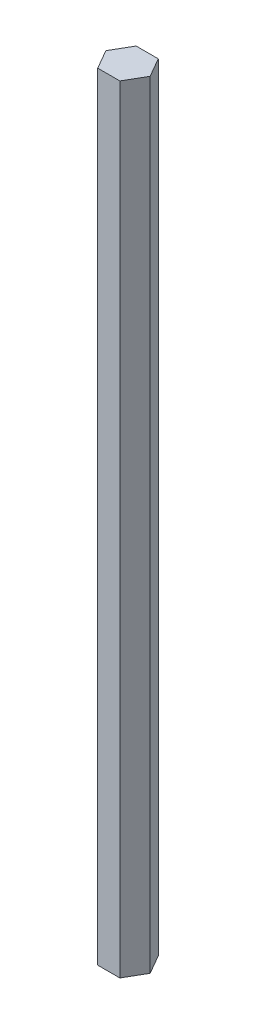
ISO-10303-21;
HEADER;
FILE_DESCRIPTION(('STEP AP214'),'2;1');
FILE_NAME('part.step','',(''),(''),'','','');
FILE_SCHEMA(('AUTOMOTIVE_DESIGN { 1 0 10303 214 1 1 1 1 }'));
ENDSEC;
DATA;
#1=APPLICATION_CONTEXT('core data for automotive mechanical design processes');
#2=APPLICATION_PROTOCOL_DEFINITION('international standard','automotive_design',2000,#1);
#3=PRODUCT_CONTEXT('',#1,'mechanical');
#4=PRODUCT('Part','Part','',(#3));
#5=PRODUCT_RELATED_PRODUCT_CATEGORY('part','',(#4));
#6=PRODUCT_DEFINITION_FORMATION('','',#4);
#7=PRODUCT_DEFINITION_CONTEXT('part definition',#1,'design');
#8=PRODUCT_DEFINITION('design','',#6,#7);
#9=PRODUCT_DEFINITION_SHAPE('','',#8);
#10=(LENGTH_UNIT() NAMED_UNIT(*) SI_UNIT(.MILLI.,.METRE.));
#11=(NAMED_UNIT(*) PLANE_ANGLE_UNIT() SI_UNIT($,.RADIAN.));
#12=(NAMED_UNIT(*) SI_UNIT($,.STERADIAN.) SOLID_ANGLE_UNIT());
#13=UNCERTAINTY_MEASURE_WITH_UNIT(LENGTH_MEASURE(1.E-05),#10,'distance_accuracy_value','');
#14=(GEOMETRIC_REPRESENTATION_CONTEXT(3) GLOBAL_UNCERTAINTY_ASSIGNED_CONTEXT((#13)) GLOBAL_UNIT_ASSIGNED_CONTEXT((#10,
#11,#12)) REPRESENTATION_CONTEXT('',''));
#15=CARTESIAN_POINT('',(0.,0.,0.));
#16=DIRECTION('',(0.,0.,1.));
#17=DIRECTION('',(1.,0.,0.));
#18=AXIS2_PLACEMENT_3D('',#15,#16,#17);
#19=CARTESIAN_POINT('',(1.5,105.2,2.59807621135332));
#20=DIRECTION('',(-0.866025403784439,0.,-0.5));
#21=DIRECTION('',(-0.5,0.,0.866025403784439));
#22=AXIS2_PLACEMENT_3D('',#19,#20,#21);
#23=PLANE('',#22);
#24=DIRECTION('',(0.5,0.,-0.866025403784439));
#25=VECTOR('',#24,1.);
#26=CARTESIAN_POINT('',(1.5,0.,2.59807621135332));
#27=LINE('',#26,#25);
#28=CARTESIAN_POINT('',(1.5,0.,2.59807621135332));
#29=VERTEX_POINT('',#28);
#30=CARTESIAN_POINT('',(3.,0.,0.));
#31=VERTEX_POINT('',#30);
#32=EDGE_CURVE('E116',#29,#31,#27,.T.);
#33=ORIENTED_EDGE('',*,*,#32,.T.);
#34=DIRECTION('',(0.,-1.,0.));
#35=VECTOR('',#34,1.);
#36=CARTESIAN_POINT('',(3.,105.2,0.));
#37=LINE('',#36,#35);
#38=CARTESIAN_POINT('',(3.,105.2,0.));
#39=VERTEX_POINT('',#38);
#40=EDGE_CURVE('E11',#39,#31,#37,.T.);
#41=ORIENTED_EDGE('',*,*,#40,.F.);
#42=DIRECTION('',(0.5,0.,-0.866025403784439));
#43=VECTOR('',#42,1.);
#44=CARTESIAN_POINT('',(1.5,105.2,2.59807621135332));
#45=LINE('',#44,#43);
#46=CARTESIAN_POINT('',(1.5,105.2,2.59807621135332));
#47=VERTEX_POINT('',#46);
#48=EDGE_CURVE('E127',#47,#39,#45,.T.);
#49=ORIENTED_EDGE('',*,*,#48,.F.);
#50=DIRECTION('',(0.,-1.,0.));
#51=VECTOR('',#50,1.);
#52=CARTESIAN_POINT('',(1.5,105.2,2.59807621135332));
#53=LINE('',#52,#51);
#54=EDGE_CURVE('E112',#47,#29,#53,.T.);
#55=ORIENTED_EDGE('',*,*,#54,.T.);
#56=EDGE_LOOP('',(#33,#41,#49,#55));
#57=FACE_BOUND('',#56,.T.);
#58=ADVANCED_FACE('F32',(#57),#23,.F.);
#59=CARTESIAN_POINT('',(3.,105.2,0.));
#60=DIRECTION('',(-0.866025403784438,0.,0.5));
#61=DIRECTION('',(0.5,0.,0.866025403784439));
#62=AXIS2_PLACEMENT_3D('',#59,#60,#61);
#63=PLANE('',#62);
#64=DIRECTION('',(-0.5,0.,-0.866025403784439));
#65=VECTOR('',#64,1.);
#66=CARTESIAN_POINT('',(3.,0.,0.));
#67=LINE('',#66,#65);
#68=CARTESIAN_POINT('',(1.5,0.,-2.59807621135332));
#69=VERTEX_POINT('',#68);
#70=EDGE_CURVE('E119',#31,#69,#67,.T.);
#71=ORIENTED_EDGE('',*,*,#70,.T.);
#72=DIRECTION('',(0.,-1.,0.));
#73=VECTOR('',#72,1.);
#74=CARTESIAN_POINT('',(1.5,105.2,-2.59807621135332));
#75=LINE('',#74,#73);
#76=CARTESIAN_POINT('',(1.5,105.2,-2.59807621135332));
#77=VERTEX_POINT('',#76);
#78=EDGE_CURVE('E40',#77,#69,#75,.T.);
#79=ORIENTED_EDGE('',*,*,#78,.F.);
#80=DIRECTION('',(-0.5,0.,-0.866025403784439));
#81=VECTOR('',#80,1.);
#82=CARTESIAN_POINT('',(3.,105.2,0.));
#83=LINE('',#82,#81);
#84=EDGE_CURVE('E85',#39,#77,#83,.T.);
#85=ORIENTED_EDGE('',*,*,#84,.F.);
#86=ORIENTED_EDGE('',*,*,#40,.T.);
#87=EDGE_LOOP('',(#71,#79,#85,#86));
#88=FACE_BOUND('',#87,.T.);
#89=ADVANCED_FACE('F151',(#88),#63,.F.);
#90=CARTESIAN_POINT('',(1.5,105.2,-2.59807621135332));
#91=DIRECTION('',(0.,0.,1.));
#92=DIRECTION('',(1.,0.,0.));
#93=AXIS2_PLACEMENT_3D('',#90,#91,#92);
#94=PLANE('',#93);
#95=DIRECTION('',(-1.,0.,0.));
#96=VECTOR('',#95,1.);
#97=CARTESIAN_POINT('',(1.5,0.,-2.59807621135332));
#98=LINE('',#97,#96);
#99=CARTESIAN_POINT('',(-1.5,0.,-2.59807621135332));
#100=VERTEX_POINT('',#99);
#101=EDGE_CURVE('E122',#69,#100,#98,.T.);
#102=ORIENTED_EDGE('',*,*,#101,.T.);
#103=DIRECTION('',(0.,-1.,0.));
#104=VECTOR('',#103,1.);
#105=CARTESIAN_POINT('',(-1.5,105.2,-2.59807621135332));
#106=LINE('',#105,#104);
#107=CARTESIAN_POINT('',(-1.5,105.2,-2.59807621135332));
#108=VERTEX_POINT('',#107);
#109=EDGE_CURVE('E107',#108,#100,#106,.T.);
#110=ORIENTED_EDGE('',*,*,#109,.F.);
#111=DIRECTION('',(-1.,0.,0.));
#112=VECTOR('',#111,1.);
#113=CARTESIAN_POINT('',(1.5,105.2,-2.59807621135332));
#114=LINE('',#113,#112);
#115=EDGE_CURVE('E98',#77,#108,#114,.T.);
#116=ORIENTED_EDGE('',*,*,#115,.F.);
#117=ORIENTED_EDGE('',*,*,#78,.T.);
#118=EDGE_LOOP('',(#102,#110,#116,#117));
#119=FACE_BOUND('',#118,.T.);
#120=ADVANCED_FACE('F133',(#119),#94,.F.);
#121=CARTESIAN_POINT('',(-1.5,105.2,-2.59807621135332));
#122=DIRECTION('',(0.866025403784439,0.,0.5));
#123=DIRECTION('',(0.5,0.,-0.866025403784439));
#124=AXIS2_PLACEMENT_3D('',#121,#122,#123);
#125=PLANE('',#124);
#126=DIRECTION('',(-0.5,0.,0.866025403784439));
#127=VECTOR('',#126,1.);
#128=CARTESIAN_POINT('',(-1.5,0.,-2.59807621135332));
#129=LINE('',#128,#127);
#130=CARTESIAN_POINT('',(-3.,0.,0.));
#131=VERTEX_POINT('',#130);
#132=EDGE_CURVE('E106',#100,#131,#129,.T.);
#133=ORIENTED_EDGE('',*,*,#132,.T.);
#134=DIRECTION('',(0.,-1.,0.));
#135=VECTOR('',#134,1.);
#136=CARTESIAN_POINT('',(-3.,105.2,0.));
#137=LINE('',#136,#135);
#138=CARTESIAN_POINT('',(-3.,105.2,0.));
#139=VERTEX_POINT('',#138);
#140=EDGE_CURVE('E103',#139,#131,#137,.T.);
#141=ORIENTED_EDGE('',*,*,#140,.F.);
#142=DIRECTION('',(-0.5,0.,0.866025403784439));
#143=VECTOR('',#142,1.);
#144=CARTESIAN_POINT('',(-1.5,105.2,-2.59807621135332));
#145=LINE('',#144,#143);
#146=EDGE_CURVE('E92',#108,#139,#145,.T.);
#147=ORIENTED_EDGE('',*,*,#146,.F.);
#148=ORIENTED_EDGE('',*,*,#109,.T.);
#149=EDGE_LOOP('',(#133,#141,#147,#148));
#150=FACE_BOUND('',#149,.T.);
#151=ADVANCED_FACE('F104',(#150),#125,.F.);
#152=CARTESIAN_POINT('',(-3.,105.2,0.));
#153=DIRECTION('',(0.866025403784439,0.,-0.5));
#154=DIRECTION('',(-0.5,0.,-0.866025403784439));
#155=AXIS2_PLACEMENT_3D('',#152,#153,#154);
#156=PLANE('',#155);
#157=DIRECTION('',(0.5,0.,0.866025403784439));
#158=VECTOR('',#157,1.);
#159=CARTESIAN_POINT('',(-3.,0.,0.));
#160=LINE('',#159,#158);
#161=CARTESIAN_POINT('',(-1.5,0.,2.59807621135332));
#162=VERTEX_POINT('',#161);
#163=EDGE_CURVE('E71',#131,#162,#160,.T.);
#164=ORIENTED_EDGE('',*,*,#163,.T.);
#165=DIRECTION('',(0.,-1.,0.));
#166=VECTOR('',#165,1.);
#167=CARTESIAN_POINT('',(-1.5,105.2,2.59807621135332));
#168=LINE('',#167,#166);
#169=CARTESIAN_POINT('',(-1.5,105.2,2.59807621135332));
#170=VERTEX_POINT('',#169);
#171=EDGE_CURVE('E108',#170,#162,#168,.T.);
#172=ORIENTED_EDGE('',*,*,#171,.F.);
#173=DIRECTION('',(0.5,0.,0.866025403784439));
#174=VECTOR('',#173,1.);
#175=CARTESIAN_POINT('',(-3.,105.2,0.));
#176=LINE('',#175,#174);
#177=EDGE_CURVE('E96',#139,#170,#176,.T.);
#178=ORIENTED_EDGE('',*,*,#177,.F.);
#179=ORIENTED_EDGE('',*,*,#140,.T.);
#180=EDGE_LOOP('',(#164,#172,#178,#179));
#181=FACE_BOUND('',#180,.T.);
#182=ADVANCED_FACE('F110',(#181),#156,.F.);
#183=CARTESIAN_POINT('',(-1.5,105.2,2.59807621135332));
#184=DIRECTION('',(0.,0.,-1.));
#185=DIRECTION('',(-1.,0.,0.));
#186=AXIS2_PLACEMENT_3D('',#183,#184,#185);
#187=PLANE('',#186);
#188=DIRECTION('',(1.,0.,0.));
#189=VECTOR('',#188,1.);
#190=CARTESIAN_POINT('',(-1.5,0.,2.59807621135332));
#191=LINE('',#190,#189);
#192=EDGE_CURVE('E77',#162,#29,#191,.T.);
#193=ORIENTED_EDGE('',*,*,#192,.T.);
#194=ORIENTED_EDGE('',*,*,#54,.F.);
#195=DIRECTION('',(1.,0.,0.));
#196=VECTOR('',#195,1.);
#197=CARTESIAN_POINT('',(-1.5,105.2,2.59807621135332));
#198=LINE('',#197,#196);
#199=EDGE_CURVE('E48',#170,#47,#198,.T.);
#200=ORIENTED_EDGE('',*,*,#199,.F.);
#201=ORIENTED_EDGE('',*,*,#171,.T.);
#202=EDGE_LOOP('',(#193,#194,#200,#201));
#203=FACE_BOUND('',#202,.T.);
#204=ADVANCED_FACE('F140',(#203),#187,.F.);
#205=CARTESIAN_POINT('',(0.,105.2,0.));
#206=DIRECTION('',(0.,1.,0.));
#207=DIRECTION('',(0.,0.,1.));
#208=AXIS2_PLACEMENT_3D('',#205,#206,#207);
#209=PLANE('',#208);
#210=ORIENTED_EDGE('',*,*,#48,.T.);
#211=ORIENTED_EDGE('',*,*,#84,.T.);
#212=ORIENTED_EDGE('',*,*,#115,.T.);
#213=ORIENTED_EDGE('',*,*,#146,.T.);
#214=ORIENTED_EDGE('',*,*,#177,.T.);
#215=ORIENTED_EDGE('',*,*,#199,.T.);
#216=EDGE_LOOP('',(#210,#211,#212,#213,#214,#215));
#217=FACE_BOUND('',#216,.T.);
#218=ADVANCED_FACE('F94',(#217),#209,.T.);
#219=CARTESIAN_POINT('',(0.,0.,0.));
#220=DIRECTION('',(0.,1.,0.));
#221=DIRECTION('',(0.,0.,1.));
#222=AXIS2_PLACEMENT_3D('',#219,#220,#221);
#223=PLANE('',#222);
#224=CARTESIAN_POINT('',(0.,0.,0.));
#225=DIRECTION('',(0.,-1.,0.));
#226=DIRECTION('',(0.,0.,-1.));
#227=AXIS2_PLACEMENT_3D('',#224,#225,#226);
#228=CIRCLE('',#227,1.6);
#229=CARTESIAN_POINT('',(0.,0.,-1.6));
#230=VERTEX_POINT('',#229);
#231=EDGE_CURVE('E213',#230,#230,#228,.T.);
#232=ORIENTED_EDGE('',*,*,#231,.F.);
#233=EDGE_LOOP('',(#232));
#234=FACE_BOUND('',#233,.T.);
#235=ORIENTED_EDGE('',*,*,#32,.F.);
#236=ORIENTED_EDGE('',*,*,#192,.F.);
#237=ORIENTED_EDGE('',*,*,#163,.F.);
#238=ORIENTED_EDGE('',*,*,#132,.F.);
#239=ORIENTED_EDGE('',*,*,#101,.F.);
#240=ORIENTED_EDGE('',*,*,#70,.F.);
#241=EDGE_LOOP('',(#235,#236,#237,#238,#239,#240));
#242=FACE_BOUND('',#241,.T.);
#243=ADVANCED_FACE('F136',(#234,#242),#223,.F.);
#244=CARTESIAN_POINT('',(0.,5.,0.));
#245=DIRECTION('',(0.,-1.,0.));
#246=DIRECTION('',(0.,0.,-1.));
#247=AXIS2_PLACEMENT_3D('',#244,#245,#246);
#248=CYLINDRICAL_SURFACE('',#247,1.6);
#249=CARTESIAN_POINT('',(0.,5.,0.));
#250=DIRECTION('',(0.,-1.,0.));
#251=DIRECTION('',(0.,0.,-1.));
#252=AXIS2_PLACEMENT_3D('',#249,#250,#251);
#253=CIRCLE('',#252,1.6);
#254=CARTESIAN_POINT('',(0.,5.,-1.6));
#255=VERTEX_POINT('',#254);
#256=EDGE_CURVE('E120',#255,#255,#253,.T.);
#257=ORIENTED_EDGE('',*,*,#256,.F.);
#258=EDGE_LOOP('',(#257));
#259=FACE_BOUND('',#258,.T.);
#260=ORIENTED_EDGE('',*,*,#231,.T.);
#261=EDGE_LOOP('',(#260));
#262=FACE_BOUND('',#261,.T.);
#263=ADVANCED_FACE('F188',(#259,#262),#248,.F.);
#264=CARTESIAN_POINT('',(0.,5.,0.));
#265=DIRECTION('',(0.,-1.,0.));
#266=DIRECTION('',(0.,0.,-1.));
#267=AXIS2_PLACEMENT_3D('',#264,#265,#266);
#268=PLANE('',#267);
#269=ORIENTED_EDGE('',*,*,#256,.T.);
#270=EDGE_LOOP('',(#269));
#271=FACE_BOUND('',#270,.T.);
#272=ADVANCED_FACE('F197',(#271),#268,.T.);
#273=CLOSED_SHELL('',(#58,#89,#120,#151,#182,#204,#218,#243,#263,#272));
#274=MANIFOLD_SOLID_BREP('B2',#273);
#275=ADVANCED_BREP_SHAPE_REPRESENTATION('',(#18,#274),#14);
#276=SHAPE_DEFINITION_REPRESENTATION(#9,#275);
ENDSEC;
END-ISO-10303-21;
